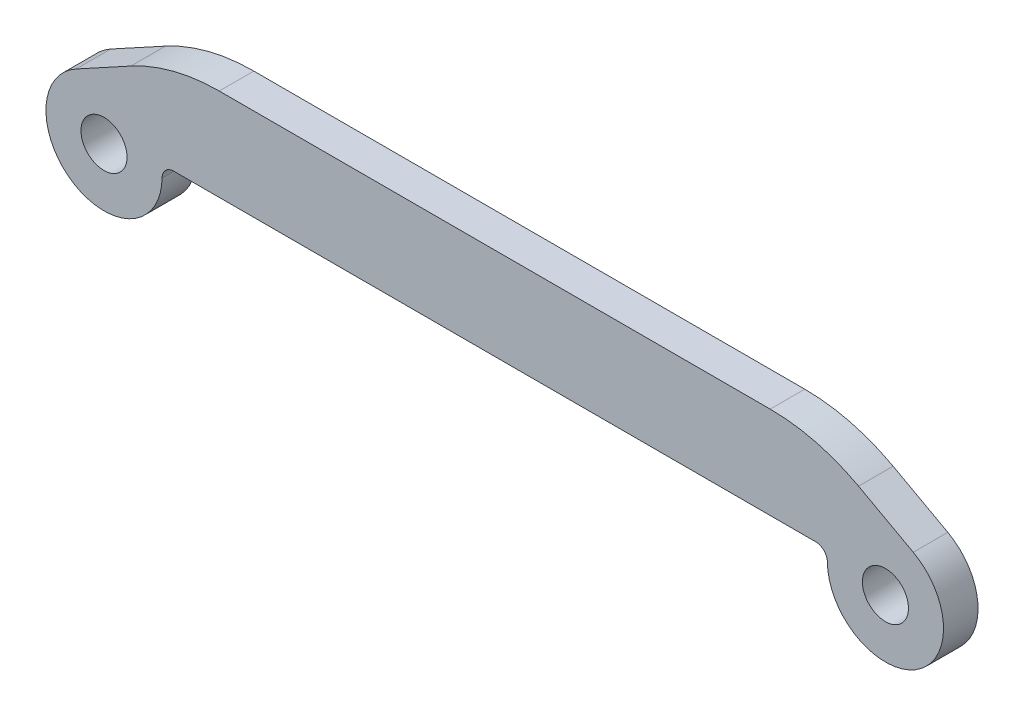
ISO-10303-21;
HEADER;
FILE_DESCRIPTION(('STEP AP214'),'2;1');
FILE_NAME('part.step','',(''),(''),'','','');
FILE_SCHEMA(('AUTOMOTIVE_DESIGN { 1 0 10303 214 1 1 1 1 }'));
ENDSEC;
DATA;
#1=APPLICATION_CONTEXT('core data for automotive mechanical design processes');
#2=APPLICATION_PROTOCOL_DEFINITION('international standard','automotive_design',2000,#1);
#3=PRODUCT_CONTEXT('',#1,'mechanical');
#4=PRODUCT('Part','Part','',(#3));
#5=PRODUCT_RELATED_PRODUCT_CATEGORY('part','',(#4));
#6=PRODUCT_DEFINITION_FORMATION('','',#4);
#7=PRODUCT_DEFINITION_CONTEXT('part definition',#1,'design');
#8=PRODUCT_DEFINITION('design','',#6,#7);
#9=PRODUCT_DEFINITION_SHAPE('','',#8);
#10=(LENGTH_UNIT() NAMED_UNIT(*) SI_UNIT(.MILLI.,.METRE.));
#11=(NAMED_UNIT(*) PLANE_ANGLE_UNIT() SI_UNIT($,.RADIAN.));
#12=(NAMED_UNIT(*) SI_UNIT($,.STERADIAN.) SOLID_ANGLE_UNIT());
#13=UNCERTAINTY_MEASURE_WITH_UNIT(LENGTH_MEASURE(1.E-05),#10,'distance_accuracy_value','');
#14=(GEOMETRIC_REPRESENTATION_CONTEXT(3) GLOBAL_UNCERTAINTY_ASSIGNED_CONTEXT((#13)) GLOBAL_UNIT_ASSIGNED_CONTEXT((#10,
#11,#12)) REPRESENTATION_CONTEXT('',''));
#15=CARTESIAN_POINT('',(0.,0.,0.));
#16=DIRECTION('',(0.,0.,1.));
#17=DIRECTION('',(1.,0.,0.));
#18=AXIS2_PLACEMENT_3D('',#15,#16,#17);
#19=CARTESIAN_POINT('',(-26.9239999999982,-7.1247,1.190625));
#20=DIRECTION('',(0.,0.,1.));
#21=DIRECTION('',(1.,0.,0.));
#22=AXIS2_PLACEMENT_3D('',#19,#20,#21);
#23=PLANE('',#22);
#24=CARTESIAN_POINT('',(-26.9239999999982,-7.1247,1.190625));
#25=DIRECTION('',(0.,0.,1.));
#26=DIRECTION('',(1.,0.,0.));
#27=AXIS2_PLACEMENT_3D('',#24,#25,#26);
#28=CIRCLE('',#27,1.5875);
#29=CARTESIAN_POINT('',(-28.5114999999982,-7.1247,1.190625));
#30=VERTEX_POINT('',#29);
#31=EDGE_CURVE('E248',#30,#30,#28,.T.);
#32=ORIENTED_EDGE('',*,*,#31,.F.);
#33=EDGE_LOOP('',(#32));
#34=FACE_BOUND('',#33,.T.);
#35=DIRECTION('',(-0.877633945750256,0.479331469097154,0.));
#36=VECTOR('',#35,1.);
#37=CARTESIAN_POINT('',(22.225,0.,1.190625));
#38=LINE('',#37,#36);
#39=CARTESIAN_POINT('',(28.8415655421214,-3.61372540002593,1.190625));
#40=VERTEX_POINT('',#39);
#41=CARTESIAN_POINT('',(25.0703922728796,-1.55404888897174,1.190625));
#42=VERTEX_POINT('',#41);
#43=EDGE_CURVE('E237',#40,#42,#38,.T.);
#44=ORIENTED_EDGE('',*,*,#43,.T.);
#45=CARTESIAN_POINT('',(18.9828826153457,-12.7,1.190625));
#46=DIRECTION('',(0.,0.,1.));
#47=DIRECTION('',(1.,0.,0.));
#48=AXIS2_PLACEMENT_3D('',#45,#46,#47);
#49=CIRCLE('',#48,12.7);
#50=CARTESIAN_POINT('',(18.9828826153457,0.,1.190625));
#51=VERTEX_POINT('',#50);
#52=EDGE_CURVE('E196',#42,#51,#49,.T.);
#53=ORIENTED_EDGE('',*,*,#52,.T.);
#54=DIRECTION('',(-1.,0.,0.));
#55=VECTOR('',#54,1.);
#56=CARTESIAN_POINT('',(-22.225,0.,1.190625));
#57=LINE('',#56,#55);
#58=CARTESIAN_POINT('',(-18.9828826153456,0.,1.190625));
#59=VERTEX_POINT('',#58);
#60=EDGE_CURVE('E166',#51,#59,#57,.T.);
#61=ORIENTED_EDGE('',*,*,#60,.T.);
#62=CARTESIAN_POINT('',(-18.9828826153456,-12.7,1.190625));
#63=DIRECTION('',(0.,0.,1.));
#64=DIRECTION('',(1.,0.,0.));
#65=AXIS2_PLACEMENT_3D('',#62,#63,#64);
#66=CIRCLE('',#65,12.7);
#67=CARTESIAN_POINT('',(-25.0703922728797,-1.55404888897191,1.190625));
#68=VERTEX_POINT('',#67);
#69=EDGE_CURVE('E69',#59,#68,#66,.T.);
#70=ORIENTED_EDGE('',*,*,#69,.T.);
#71=DIRECTION('',(-0.877633945750243,-0.479331469097178,0.));
#72=VECTOR('',#71,1.);
#73=CARTESIAN_POINT('',(-22.225,0.,1.190625));
#74=LINE('',#73,#72);
#75=CARTESIAN_POINT('',(-28.8415655421214,-3.61372540002615,1.190625));
#76=VERTEX_POINT('',#75);
#77=EDGE_CURVE('E131',#68,#76,#74,.T.);
#78=ORIENTED_EDGE('',*,*,#77,.T.);
#79=CARTESIAN_POINT('',(-26.9239999999982,-7.1247,1.190625));
#80=DIRECTION('',(0.,0.,1.));
#81=DIRECTION('',(1.,0.,0.));
#82=AXIS2_PLACEMENT_3D('',#79,#80,#81);
#83=CIRCLE('',#82,4.0005);
#84=CARTESIAN_POINT('',(-22.9236253300362,-7.15636622691118,1.190625));
#85=VERTEX_POINT('',#84);
#86=EDGE_CURVE('E134',#76,#85,#83,.T.);
#87=ORIENTED_EDGE('',*,*,#86,.T.);
#88=CARTESIAN_POINT('',(-22.110850793917,-7.16279999999789,1.190625));
#89=DIRECTION('',(0.,0.,1.));
#90=DIRECTION('',(1.,0.,0.));
#91=AXIS2_PLACEMENT_3D('',#88,#89,#90);
#92=CIRCLE('',#91,0.8128);
#93=CARTESIAN_POINT('',(-22.1108507939169,-6.34999999999995,1.190625));
#94=VERTEX_POINT('',#93);
#95=EDGE_CURVE('E205',#85,#94,#92,.F.);
#96=ORIENTED_EDGE('',*,*,#95,.T.);
#97=DIRECTION('',(1.,0.,0.));
#98=VECTOR('',#97,1.);
#99=CARTESIAN_POINT('',(-22.9992273747369,-6.35,1.190625));
#100=LINE('',#99,#98);
#101=CARTESIAN_POINT('',(22.1108507939171,-6.34999999999768,1.190625));
#102=VERTEX_POINT('',#101);
#103=EDGE_CURVE('E151',#94,#102,#100,.T.);
#104=ORIENTED_EDGE('',*,*,#103,.T.);
#105=CARTESIAN_POINT('',(22.110850793917,-7.16279999999974,1.190625));
#106=DIRECTION('',(0.,0.,1.));
#107=DIRECTION('',(1.,0.,0.));
#108=AXIS2_PLACEMENT_3D('',#105,#106,#107);
#109=CIRCLE('',#108,0.8128);
#110=CARTESIAN_POINT('',(22.9236253300363,-7.15636622691268,1.190625));
#111=VERTEX_POINT('',#110);
#112=EDGE_CURVE('E12',#102,#111,#109,.F.);
#113=ORIENTED_EDGE('',*,*,#112,.T.);
#114=CARTESIAN_POINT('',(26.9239999999982,-7.12469999999978,1.190625));
#115=DIRECTION('',(0.,0.,1.));
#116=DIRECTION('',(-1.,0.,0.));
#117=AXIS2_PLACEMENT_3D('',#114,#115,#116);
#118=CIRCLE('',#117,4.0005);
#119=EDGE_CURVE('E232',#111,#40,#118,.T.);
#120=ORIENTED_EDGE('',*,*,#119,.T.);
#121=EDGE_LOOP('',(#44,#53,#61,#70,#78,#87,#96,#104,#113,#120));
#122=FACE_BOUND('',#121,.T.);
#123=CARTESIAN_POINT('',(26.9239999999982,-7.12469999999978,1.190625));
#124=DIRECTION('',(0.,0.,1.));
#125=DIRECTION('',(-1.,0.,0.));
#126=AXIS2_PLACEMENT_3D('',#123,#124,#125);
#127=CIRCLE('',#126,1.5875);
#128=CARTESIAN_POINT('',(25.3364999999982,-7.12469999999978,1.190625));
#129=VERTEX_POINT('',#128);
#130=EDGE_CURVE('E419',#129,#129,#127,.T.);
#131=ORIENTED_EDGE('',*,*,#130,.F.);
#132=EDGE_LOOP('',(#131));
#133=FACE_BOUND('',#132,.T.);
#134=ADVANCED_FACE('F53',(#34,#122,#133),#23,.T.);
#135=CARTESIAN_POINT('',(-26.9239999999982,-7.1247,-1.190625));
#136=DIRECTION('',(0.,0.,1.));
#137=DIRECTION('',(1.,0.,0.));
#138=AXIS2_PLACEMENT_3D('',#135,#136,#137);
#139=PLANE('',#138);
#140=DIRECTION('',(-1.,0.,0.));
#141=VECTOR('',#140,1.);
#142=CARTESIAN_POINT('',(-22.225,0.,-1.190625));
#143=LINE('',#142,#141);
#144=CARTESIAN_POINT('',(18.9828826153457,0.,-1.190625));
#145=VERTEX_POINT('',#144);
#146=CARTESIAN_POINT('',(-18.9828826153456,0.,-1.190625));
#147=VERTEX_POINT('',#146);
#148=EDGE_CURVE('E141',#145,#147,#143,.T.);
#149=ORIENTED_EDGE('',*,*,#148,.F.);
#150=CARTESIAN_POINT('',(18.9828826153457,-12.7,-1.190625));
#151=DIRECTION('',(0.,0.,1.));
#152=DIRECTION('',(1.,0.,0.));
#153=AXIS2_PLACEMENT_3D('',#150,#151,#152);
#154=CIRCLE('',#153,12.7);
#155=CARTESIAN_POINT('',(25.0703922728796,-1.55404888897174,-1.190625));
#156=VERTEX_POINT('',#155);
#157=EDGE_CURVE('E189',#145,#156,#154,.F.);
#158=ORIENTED_EDGE('',*,*,#157,.T.);
#159=DIRECTION('',(-0.877633945750256,0.479331469097154,0.));
#160=VECTOR('',#159,1.);
#161=CARTESIAN_POINT('',(22.225,0.,-1.190625));
#162=LINE('',#161,#160);
#163=CARTESIAN_POINT('',(28.8415655421214,-3.61372540002593,-1.190625));
#164=VERTEX_POINT('',#163);
#165=EDGE_CURVE('E253',#164,#156,#162,.T.);
#166=ORIENTED_EDGE('',*,*,#165,.F.);
#167=CARTESIAN_POINT('',(26.9239999999982,-7.12469999999978,-1.190625));
#168=DIRECTION('',(0.,0.,1.));
#169=DIRECTION('',(-1.,0.,0.));
#170=AXIS2_PLACEMENT_3D('',#167,#168,#169);
#171=CIRCLE('',#170,4.0005);
#172=CARTESIAN_POINT('',(22.9236253300363,-7.15636622691268,-1.190625));
#173=VERTEX_POINT('',#172);
#174=EDGE_CURVE('E217',#173,#164,#171,.T.);
#175=ORIENTED_EDGE('',*,*,#174,.F.);
#176=CARTESIAN_POINT('',(22.110850793917,-7.16279999999974,-1.190625));
#177=DIRECTION('',(0.,0.,1.));
#178=DIRECTION('',(1.,0.,0.));
#179=AXIS2_PLACEMENT_3D('',#176,#177,#178);
#180=CIRCLE('',#179,0.8128);
#181=CARTESIAN_POINT('',(22.1108507939171,-6.34999999999974,-1.190625));
#182=VERTEX_POINT('',#181);
#183=EDGE_CURVE('E62',#173,#182,#180,.T.);
#184=ORIENTED_EDGE('',*,*,#183,.T.);
#185=DIRECTION('',(1.,0.,0.));
#186=VECTOR('',#185,1.);
#187=CARTESIAN_POINT('',(22.999227374737,-6.34999999999978,-1.190625));
#188=LINE('',#187,#186);
#189=CARTESIAN_POINT('',(-22.1108507939169,-6.34999999999789,-1.190625));
#190=VERTEX_POINT('',#189);
#191=EDGE_CURVE('E215',#190,#182,#188,.T.);
#192=ORIENTED_EDGE('',*,*,#191,.F.);
#193=CARTESIAN_POINT('',(-22.110850793917,-7.16279999999789,-1.190625));
#194=DIRECTION('',(0.,0.,1.));
#195=DIRECTION('',(1.,0.,0.));
#196=AXIS2_PLACEMENT_3D('',#193,#194,#195);
#197=CIRCLE('',#196,0.8128);
#198=CARTESIAN_POINT('',(-22.9236253300362,-7.15636622691118,-1.190625));
#199=VERTEX_POINT('',#198);
#200=EDGE_CURVE('E202',#190,#199,#197,.T.);
#201=ORIENTED_EDGE('',*,*,#200,.T.);
#202=CARTESIAN_POINT('',(-26.9239999999982,-7.1247,-1.190625));
#203=DIRECTION('',(0.,0.,1.));
#204=DIRECTION('',(1.,0.,0.));
#205=AXIS2_PLACEMENT_3D('',#202,#203,#204);
#206=CIRCLE('',#205,4.0005);
#207=CARTESIAN_POINT('',(-28.8415655421214,-3.61372540002615,-1.190625));
#208=VERTEX_POINT('',#207);
#209=EDGE_CURVE('E227',#208,#199,#206,.T.);
#210=ORIENTED_EDGE('',*,*,#209,.F.);
#211=DIRECTION('',(-0.877633945750243,-0.479331469097178,0.));
#212=VECTOR('',#211,1.);
#213=CARTESIAN_POINT('',(-22.225,0.,-1.190625));
#214=LINE('',#213,#212);
#215=CARTESIAN_POINT('',(-25.0703922728797,-1.55404888897191,-1.190625));
#216=VERTEX_POINT('',#215);
#217=EDGE_CURVE('E155',#216,#208,#214,.T.);
#218=ORIENTED_EDGE('',*,*,#217,.F.);
#219=CARTESIAN_POINT('',(-18.9828826153456,-12.7,-1.190625));
#220=DIRECTION('',(0.,0.,1.));
#221=DIRECTION('',(1.,0.,0.));
#222=AXIS2_PLACEMENT_3D('',#219,#220,#221);
#223=CIRCLE('',#222,12.7);
#224=EDGE_CURVE('E186',#216,#147,#223,.F.);
#225=ORIENTED_EDGE('',*,*,#224,.T.);
#226=EDGE_LOOP('',(#149,#158,#166,#175,#184,#192,#201,#210,#218,#225));
#227=FACE_BOUND('',#226,.T.);
#228=CARTESIAN_POINT('',(-26.9239999999982,-7.1247,-1.190625));
#229=DIRECTION('',(0.,0.,1.));
#230=DIRECTION('',(1.,0.,0.));
#231=AXIS2_PLACEMENT_3D('',#228,#229,#230);
#232=CIRCLE('',#231,1.5875);
#233=CARTESIAN_POINT('',(-28.5114999999982,-7.1247,-1.190625));
#234=VERTEX_POINT('',#233);
#235=EDGE_CURVE('E417',#234,#234,#232,.T.);
#236=ORIENTED_EDGE('',*,*,#235,.T.);
#237=EDGE_LOOP('',(#236));
#238=FACE_BOUND('',#237,.T.);
#239=CARTESIAN_POINT('',(26.9239999999982,-7.12469999999978,-1.190625));
#240=DIRECTION('',(0.,0.,1.));
#241=DIRECTION('',(-1.,0.,0.));
#242=AXIS2_PLACEMENT_3D('',#239,#240,#241);
#243=CIRCLE('',#242,1.5875);
#244=CARTESIAN_POINT('',(25.3364999999982,-7.12469999999978,-1.190625));
#245=VERTEX_POINT('',#244);
#246=EDGE_CURVE('E425',#245,#245,#243,.T.);
#247=ORIENTED_EDGE('',*,*,#246,.T.);
#248=EDGE_LOOP('',(#247));
#249=FACE_BOUND('',#248,.T.);
#250=ADVANCED_FACE('F213',(#227,#238,#249),#139,.F.);
#251=CARTESIAN_POINT('',(-22.225,0.,1.190625));
#252=DIRECTION('',(0.479331469097178,-0.877633945750243,0.));
#253=DIRECTION('',(0.877633945750243,0.479331469097178,0.));
#254=AXIS2_PLACEMENT_3D('',#251,#252,#253);
#255=PLANE('',#254);
#256=ORIENTED_EDGE('',*,*,#77,.F.);
#257=DIRECTION('',(0.,0.,-1.));
#258=VECTOR('',#257,1.);
#259=CARTESIAN_POINT('',(-25.0703922728797,-1.55404888897191,1.190625));
#260=LINE('',#259,#258);
#261=EDGE_CURVE('E199',#68,#216,#260,.T.);
#262=ORIENTED_EDGE('',*,*,#261,.T.);
#263=ORIENTED_EDGE('',*,*,#217,.T.);
#264=DIRECTION('',(0.,0.,-1.));
#265=VECTOR('',#264,1.);
#266=CARTESIAN_POINT('',(-28.8415655421214,-3.61372540002615,1.190625));
#267=LINE('',#266,#265);
#268=EDGE_CURVE('E147',#76,#208,#267,.T.);
#269=ORIENTED_EDGE('',*,*,#268,.F.);
#270=EDGE_LOOP('',(#256,#262,#263,#269));
#271=FACE_BOUND('',#270,.T.);
#272=ADVANCED_FACE('F153',(#271),#255,.F.);
#273=CARTESIAN_POINT('',(-26.9239999999982,-7.1247,1.190625));
#274=DIRECTION('',(0.,0.,-1.));
#275=DIRECTION('',(-1.,0.,0.));
#276=AXIS2_PLACEMENT_3D('',#273,#274,#275);
#277=CYLINDRICAL_SURFACE('',#276,4.0005);
#278=ORIENTED_EDGE('',*,*,#209,.T.);
#279=DIRECTION('',(0.,0.,-1.));
#280=VECTOR('',#279,1.);
#281=CARTESIAN_POINT('',(-22.9236253300362,-7.15636622691118,1.190625));
#282=LINE('',#281,#280);
#283=EDGE_CURVE('E149',#199,#85,#282,.F.);
#284=ORIENTED_EDGE('',*,*,#283,.T.);
#285=ORIENTED_EDGE('',*,*,#86,.F.);
#286=ORIENTED_EDGE('',*,*,#268,.T.);
#287=EDGE_LOOP('',(#278,#284,#285,#286));
#288=FACE_BOUND('',#287,.T.);
#289=ADVANCED_FACE('F146',(#288),#277,.T.);
#290=CARTESIAN_POINT('',(22.999227374737,-6.34999999999978,1.190625));
#291=DIRECTION('',(0.,1.,0.));
#292=DIRECTION('',(-1.,0.,0.));
#293=AXIS2_PLACEMENT_3D('',#290,#291,#292);
#294=PLANE('',#293);
#295=ORIENTED_EDGE('',*,*,#103,.F.);
#296=DIRECTION('',(0.,0.,1.));
#297=VECTOR('',#296,1.);
#298=CARTESIAN_POINT('',(-22.1108507939169,-6.34999999999789,-1.190625));
#299=LINE('',#298,#297);
#300=EDGE_CURVE('E163',#94,#190,#299,.F.);
#301=ORIENTED_EDGE('',*,*,#300,.T.);
#302=ORIENTED_EDGE('',*,*,#191,.T.);
#303=DIRECTION('',(0.,0.,1.));
#304=VECTOR('',#303,1.);
#305=CARTESIAN_POINT('',(22.1108507939171,-6.34999999999974,1.190625));
#306=LINE('',#305,#304);
#307=EDGE_CURVE('E158',#182,#102,#306,.T.);
#308=ORIENTED_EDGE('',*,*,#307,.T.);
#309=EDGE_LOOP('',(#295,#301,#302,#308));
#310=FACE_BOUND('',#309,.T.);
#311=ADVANCED_FACE('F223',(#310),#294,.F.);
#312=CARTESIAN_POINT('',(26.9239999999982,-7.12469999999978,1.190625));
#313=DIRECTION('',(0.,0.,-1.));
#314=DIRECTION('',(-1.,0.,0.));
#315=AXIS2_PLACEMENT_3D('',#312,#313,#314);
#316=CYLINDRICAL_SURFACE('',#315,4.0005);
#317=ORIENTED_EDGE('',*,*,#119,.F.);
#318=DIRECTION('',(0.,0.,-1.));
#319=VECTOR('',#318,1.);
#320=CARTESIAN_POINT('',(22.9236253300363,-7.15636622691268,1.190625));
#321=LINE('',#320,#319);
#322=EDGE_CURVE('E175',#111,#173,#321,.T.);
#323=ORIENTED_EDGE('',*,*,#322,.T.);
#324=ORIENTED_EDGE('',*,*,#174,.T.);
#325=DIRECTION('',(0.,0.,-1.));
#326=VECTOR('',#325,1.);
#327=CARTESIAN_POINT('',(28.8415655421214,-3.61372540002593,1.190625));
#328=LINE('',#327,#326);
#329=EDGE_CURVE('E159',#40,#164,#328,.T.);
#330=ORIENTED_EDGE('',*,*,#329,.F.);
#331=EDGE_LOOP('',(#317,#323,#324,#330));
#332=FACE_BOUND('',#331,.T.);
#333=ADVANCED_FACE('F235',(#332),#316,.T.);
#334=CARTESIAN_POINT('',(22.225,0.,1.190625));
#335=DIRECTION('',(-0.479331469097154,-0.877633945750257,0.));
#336=DIRECTION('',(0.877633945750256,-0.479331469097154,0.));
#337=AXIS2_PLACEMENT_3D('',#334,#335,#336);
#338=PLANE('',#337);
#339=ORIENTED_EDGE('',*,*,#165,.T.);
#340=DIRECTION('',(0.,0.,-1.));
#341=VECTOR('',#340,1.);
#342=CARTESIAN_POINT('',(25.0703922728796,-1.55404888897174,1.190625));
#343=LINE('',#342,#341);
#344=EDGE_CURVE('E77',#156,#42,#343,.F.);
#345=ORIENTED_EDGE('',*,*,#344,.T.);
#346=ORIENTED_EDGE('',*,*,#43,.F.);
#347=ORIENTED_EDGE('',*,*,#329,.T.);
#348=EDGE_LOOP('',(#339,#345,#346,#347));
#349=FACE_BOUND('',#348,.T.);
#350=ADVANCED_FACE('F290',(#349),#338,.F.);
#351=CARTESIAN_POINT('',(-22.225,0.,1.190625));
#352=DIRECTION('',(0.,-1.,0.));
#353=DIRECTION('',(0.,0.,-1.));
#354=AXIS2_PLACEMENT_3D('',#351,#352,#353);
#355=PLANE('',#354);
#356=ORIENTED_EDGE('',*,*,#60,.F.);
#357=DIRECTION('',(0.,0.,-1.));
#358=VECTOR('',#357,1.);
#359=CARTESIAN_POINT('',(18.9828826153457,0.,1.190625));
#360=LINE('',#359,#358);
#361=EDGE_CURVE('E182',#51,#145,#360,.T.);
#362=ORIENTED_EDGE('',*,*,#361,.T.);
#363=ORIENTED_EDGE('',*,*,#148,.T.);
#364=DIRECTION('',(0.,0.,-1.));
#365=VECTOR('',#364,1.);
#366=CARTESIAN_POINT('',(-18.9828826153456,0.,1.190625));
#367=LINE('',#366,#365);
#368=EDGE_CURVE('E179',#147,#59,#367,.F.);
#369=ORIENTED_EDGE('',*,*,#368,.T.);
#370=EDGE_LOOP('',(#356,#362,#363,#369));
#371=FACE_BOUND('',#370,.T.);
#372=ADVANCED_FACE('F260',(#371),#355,.F.);
#373=CARTESIAN_POINT('',(-26.9239999999982,-7.1247,1.190625));
#374=DIRECTION('',(0.,0.,-1.));
#375=DIRECTION('',(-1.,0.,0.));
#376=AXIS2_PLACEMENT_3D('',#373,#374,#375);
#377=CYLINDRICAL_SURFACE('',#376,1.5875);
#378=CARTESIAN_POINT('',(-28.5114999999982,-7.1247,1.190625));
#379=CARTESIAN_POINT('',(-28.5114999999982,-7.1247,1.1658203125));
#380=CARTESIAN_POINT('',(-28.5114999999982,-7.1247,1.141015625));
#381=CARTESIAN_POINT('',(-28.5114999999982,-7.1247,1.09140625));
#382=CARTESIAN_POINT('',(-28.5114999999982,-7.1247,1.0666015625));
#383=CARTESIAN_POINT('',(-28.5114999999982,-7.1247,1.0169921875));
#384=CARTESIAN_POINT('',(-28.5114999999982,-7.1247,0.9921875));
#385=CARTESIAN_POINT('',(-28.5114999999982,-7.1247,0.942578125));
#386=CARTESIAN_POINT('',(-28.5114999999982,-7.1247,0.9177734375));
#387=CARTESIAN_POINT('',(-28.5114999999982,-7.1247,0.8681640625));
#388=CARTESIAN_POINT('',(-28.5114999999982,-7.1247,0.843359375));
#389=CARTESIAN_POINT('',(-28.5114999999982,-7.1247,0.79375));
#390=CARTESIAN_POINT('',(-28.5114999999982,-7.1247,0.7689453125));
#391=CARTESIAN_POINT('',(-28.5114999999982,-7.1247,0.7193359375));
#392=CARTESIAN_POINT('',(-28.5114999999982,-7.1247,0.69453125));
#393=CARTESIAN_POINT('',(-28.5114999999982,-7.1247,0.644921875));
#394=CARTESIAN_POINT('',(-28.5114999999982,-7.1247,0.6201171875));
#395=CARTESIAN_POINT('',(-28.5114999999982,-7.1247,0.5705078125));
#396=CARTESIAN_POINT('',(-28.5114999999982,-7.1247,0.545703125));
#397=CARTESIAN_POINT('',(-28.5114999999982,-7.1247,0.49609375));
#398=CARTESIAN_POINT('',(-28.5114999999982,-7.1247,0.4712890625));
#399=CARTESIAN_POINT('',(-28.5114999999982,-7.1247,0.4216796875));
#400=CARTESIAN_POINT('',(-28.5114999999982,-7.1247,0.396875));
#401=CARTESIAN_POINT('',(-28.5114999999982,-7.1247,0.347265625));
#402=CARTESIAN_POINT('',(-28.5114999999982,-7.1247,0.3224609375));
#403=CARTESIAN_POINT('',(-28.5114999999982,-7.1247,0.2728515625));
#404=CARTESIAN_POINT('',(-28.5114999999982,-7.1247,0.248046875));
#405=CARTESIAN_POINT('',(-28.5114999999982,-7.1247,0.1984375));
#406=CARTESIAN_POINT('',(-28.5114999999982,-7.1247,0.1736328125));
#407=CARTESIAN_POINT('',(-28.5114999999982,-7.1247,0.1240234375));
#408=CARTESIAN_POINT('',(-28.5114999999982,-7.1247,0.0992187499999998));
#409=CARTESIAN_POINT('',(-28.5114999999982,-7.1247,0.0496093749999998));
#410=CARTESIAN_POINT('',(-28.5114999999982,-7.1247,0.0248046874999998));
#411=CARTESIAN_POINT('',(-28.5114999999982,-7.1247,-0.0248046875000002));
#412=CARTESIAN_POINT('',(-28.5114999999982,-7.1247,-0.0496093750000002));
#413=CARTESIAN_POINT('',(-28.5114999999982,-7.1247,-0.0992187500000003));
#414=CARTESIAN_POINT('',(-28.5114999999982,-7.1247,-0.1240234375));
#415=CARTESIAN_POINT('',(-28.5114999999982,-7.1247,-0.1736328125));
#416=CARTESIAN_POINT('',(-28.5114999999982,-7.1247,-0.1984375));
#417=CARTESIAN_POINT('',(-28.5114999999982,-7.1247,-0.248046875));
#418=CARTESIAN_POINT('',(-28.5114999999982,-7.1247,-0.2728515625));
#419=CARTESIAN_POINT('',(-28.5114999999982,-7.1247,-0.3224609375));
#420=CARTESIAN_POINT('',(-28.5114999999982,-7.1247,-0.347265625));
#421=CARTESIAN_POINT('',(-28.5114999999982,-7.1247,-0.396875));
#422=CARTESIAN_POINT('',(-28.5114999999982,-7.1247,-0.4216796875));
#423=CARTESIAN_POINT('',(-28.5114999999982,-7.1247,-0.4712890625));
#424=CARTESIAN_POINT('',(-28.5114999999982,-7.1247,-0.49609375));
#425=CARTESIAN_POINT('',(-28.5114999999982,-7.1247,-0.545703125));
#426=CARTESIAN_POINT('',(-28.5114999999982,-7.1247,-0.5705078125));
#427=CARTESIAN_POINT('',(-28.5114999999982,-7.1247,-0.6201171875));
#428=CARTESIAN_POINT('',(-28.5114999999982,-7.1247,-0.644921875));
#429=CARTESIAN_POINT('',(-28.5114999999982,-7.1247,-0.69453125));
#430=CARTESIAN_POINT('',(-28.5114999999982,-7.1247,-0.7193359375));
#431=CARTESIAN_POINT('',(-28.5114999999982,-7.1247,-0.7689453125));
#432=CARTESIAN_POINT('',(-28.5114999999982,-7.1247,-0.79375));
#433=CARTESIAN_POINT('',(-28.5114999999982,-7.1247,-0.843359375));
#434=CARTESIAN_POINT('',(-28.5114999999982,-7.1247,-0.8681640625));
#435=CARTESIAN_POINT('',(-28.5114999999982,-7.1247,-0.9177734375));
#436=CARTESIAN_POINT('',(-28.5114999999982,-7.1247,-0.942578125));
#437=CARTESIAN_POINT('',(-28.5114999999982,-7.1247,-0.9921875));
#438=CARTESIAN_POINT('',(-28.5114999999982,-7.1247,-1.0169921875));
#439=CARTESIAN_POINT('',(-28.5114999999982,-7.1247,-1.0666015625));
#440=CARTESIAN_POINT('',(-28.5114999999982,-7.1247,-1.09140625));
#441=CARTESIAN_POINT('',(-28.5114999999982,-7.1247,-1.141015625));
#442=CARTESIAN_POINT('',(-28.5114999999982,-7.1247,-1.1658203125));
#443=CARTESIAN_POINT('',(-28.5114999999982,-7.1247,-1.190625));
#444=B_SPLINE_CURVE_WITH_KNOTS('',3,(#378,#379,#380,#381,#382,#383,#384,#385,#386,#387,#388,
#389,#390,#391,#392,#393,#394,#395,#396,#397,#398,#399,#400,#401,#402,#403,#404,#405,#406,#407,
#408,#409,#410,#411,#412,#413,#414,#415,#416,#417,#418,#419,#420,#421,#422,#423,#424,#425,#426,
#427,#428,#429,#430,#431,#432,#433,#434,#435,#436,#437,#438,#439,#440,#441,#442,#443),
.UNSPECIFIED.,.F.,.F.,(4,2,2,2,2,2,2,2,2,2,2,2,2,2,2,2,2,2,2,2,2,2,2,2,2,2,2,2,2,2,2,2,4),(0.,
0.0744140624999998,0.148828125,0.2232421875,0.29765625,0.3720703125,0.446484375,0.5208984375,
0.5953125,0.6697265625,0.744140625,0.8185546875,0.89296875,0.9673828125,1.041796875,
1.1162109375,1.190625,1.2650390625,1.339453125,1.4138671875,1.48828125,1.5626953125,1.637109375,
1.7115234375,1.7859375,1.8603515625,1.934765625,2.0091796875,2.08359375,2.1580078125,
2.232421875,2.3068359375,2.38125),.UNSPECIFIED.);
#445=EDGE_CURVE('BSEAM275',#30,#234,#444,.T.);
#446=ORIENTED_EDGE('',*,*,#31,.T.);
#447=ORIENTED_EDGE('',*,*,#235,.F.);
#448=ORIENTED_EDGE('',*,*,#445,.T.);
#449=ORIENTED_EDGE('',*,*,#445,.F.);
#450=EDGE_LOOP('',(#446,#448,#447,#449));
#451=FACE_BOUND('',#450,.T.);
#452=ADVANCED_FACE('F275',(#451),#377,.F.);
#453=CARTESIAN_POINT('',(26.9239999999982,-7.12469999999978,1.190625));
#454=DIRECTION('',(0.,0.,-1.));
#455=DIRECTION('',(-1.,0.,0.));
#456=AXIS2_PLACEMENT_3D('',#453,#454,#455);
#457=CYLINDRICAL_SURFACE('',#456,1.5875);
#458=CARTESIAN_POINT('',(25.3364999999982,-7.12469999999978,1.190625));
#459=CARTESIAN_POINT('',(25.3364999999982,-7.12469999999978,1.1658203125));
#460=CARTESIAN_POINT('',(25.3364999999982,-7.12469999999978,1.141015625));
#461=CARTESIAN_POINT('',(25.3364999999982,-7.12469999999978,1.09140625));
#462=CARTESIAN_POINT('',(25.3364999999982,-7.12469999999978,1.0666015625));
#463=CARTESIAN_POINT('',(25.3364999999982,-7.12469999999978,1.0169921875));
#464=CARTESIAN_POINT('',(25.3364999999982,-7.12469999999978,0.9921875));
#465=CARTESIAN_POINT('',(25.3364999999982,-7.12469999999978,0.942578125));
#466=CARTESIAN_POINT('',(25.3364999999982,-7.12469999999978,0.9177734375));
#467=CARTESIAN_POINT('',(25.3364999999982,-7.12469999999978,0.8681640625));
#468=CARTESIAN_POINT('',(25.3364999999982,-7.12469999999978,0.843359375));
#469=CARTESIAN_POINT('',(25.3364999999982,-7.12469999999978,0.79375));
#470=CARTESIAN_POINT('',(25.3364999999982,-7.12469999999978,0.7689453125));
#471=CARTESIAN_POINT('',(25.3364999999982,-7.12469999999978,0.7193359375));
#472=CARTESIAN_POINT('',(25.3364999999982,-7.12469999999978,0.69453125));
#473=CARTESIAN_POINT('',(25.3364999999982,-7.12469999999978,0.644921875));
#474=CARTESIAN_POINT('',(25.3364999999982,-7.12469999999978,0.6201171875));
#475=CARTESIAN_POINT('',(25.3364999999982,-7.12469999999978,0.5705078125));
#476=CARTESIAN_POINT('',(25.3364999999982,-7.12469999999978,0.545703125));
#477=CARTESIAN_POINT('',(25.3364999999982,-7.12469999999978,0.49609375));
#478=CARTESIAN_POINT('',(25.3364999999982,-7.12469999999978,0.4712890625));
#479=CARTESIAN_POINT('',(25.3364999999982,-7.12469999999978,0.4216796875));
#480=CARTESIAN_POINT('',(25.3364999999982,-7.12469999999978,0.396875));
#481=CARTESIAN_POINT('',(25.3364999999982,-7.12469999999978,0.347265625));
#482=CARTESIAN_POINT('',(25.3364999999982,-7.12469999999978,0.3224609375));
#483=CARTESIAN_POINT('',(25.3364999999982,-7.12469999999978,0.2728515625));
#484=CARTESIAN_POINT('',(25.3364999999982,-7.12469999999978,0.248046875));
#485=CARTESIAN_POINT('',(25.3364999999982,-7.12469999999978,0.1984375));
#486=CARTESIAN_POINT('',(25.3364999999982,-7.12469999999978,0.1736328125));
#487=CARTESIAN_POINT('',(25.3364999999982,-7.12469999999978,0.1240234375));
#488=CARTESIAN_POINT('',(25.3364999999982,-7.12469999999978,0.0992187499999998));
#489=CARTESIAN_POINT('',(25.3364999999982,-7.12469999999978,0.0496093749999998));
#490=CARTESIAN_POINT('',(25.3364999999982,-7.12469999999978,0.0248046874999998));
#491=CARTESIAN_POINT('',(25.3364999999982,-7.12469999999978,-0.0248046875000002));
#492=CARTESIAN_POINT('',(25.3364999999982,-7.12469999999978,-0.0496093750000002));
#493=CARTESIAN_POINT('',(25.3364999999982,-7.12469999999978,-0.0992187500000003));
#494=CARTESIAN_POINT('',(25.3364999999982,-7.12469999999978,-0.1240234375));
#495=CARTESIAN_POINT('',(25.3364999999982,-7.12469999999978,-0.1736328125));
#496=CARTESIAN_POINT('',(25.3364999999982,-7.12469999999978,-0.1984375));
#497=CARTESIAN_POINT('',(25.3364999999982,-7.12469999999978,-0.248046875));
#498=CARTESIAN_POINT('',(25.3364999999982,-7.12469999999978,-0.2728515625));
#499=CARTESIAN_POINT('',(25.3364999999982,-7.12469999999978,-0.3224609375));
#500=CARTESIAN_POINT('',(25.3364999999982,-7.12469999999978,-0.347265625));
#501=CARTESIAN_POINT('',(25.3364999999982,-7.12469999999978,-0.396875));
#502=CARTESIAN_POINT('',(25.3364999999982,-7.12469999999978,-0.4216796875));
#503=CARTESIAN_POINT('',(25.3364999999982,-7.12469999999978,-0.4712890625));
#504=CARTESIAN_POINT('',(25.3364999999982,-7.12469999999978,-0.49609375));
#505=CARTESIAN_POINT('',(25.3364999999982,-7.12469999999978,-0.545703125));
#506=CARTESIAN_POINT('',(25.3364999999982,-7.12469999999978,-0.5705078125));
#507=CARTESIAN_POINT('',(25.3364999999982,-7.12469999999978,-0.6201171875));
#508=CARTESIAN_POINT('',(25.3364999999982,-7.12469999999978,-0.644921875));
#509=CARTESIAN_POINT('',(25.3364999999982,-7.12469999999978,-0.69453125));
#510=CARTESIAN_POINT('',(25.3364999999982,-7.12469999999978,-0.7193359375));
#511=CARTESIAN_POINT('',(25.3364999999982,-7.12469999999978,-0.7689453125));
#512=CARTESIAN_POINT('',(25.3364999999982,-7.12469999999978,-0.79375));
#513=CARTESIAN_POINT('',(25.3364999999982,-7.12469999999978,-0.843359375));
#514=CARTESIAN_POINT('',(25.3364999999982,-7.12469999999978,-0.8681640625));
#515=CARTESIAN_POINT('',(25.3364999999982,-7.12469999999978,-0.9177734375));
#516=CARTESIAN_POINT('',(25.3364999999982,-7.12469999999978,-0.942578125));
#517=CARTESIAN_POINT('',(25.3364999999982,-7.12469999999978,-0.9921875));
#518=CARTESIAN_POINT('',(25.3364999999982,-7.12469999999978,-1.0169921875));
#519=CARTESIAN_POINT('',(25.3364999999982,-7.12469999999978,-1.0666015625));
#520=CARTESIAN_POINT('',(25.3364999999982,-7.12469999999978,-1.09140625));
#521=CARTESIAN_POINT('',(25.3364999999982,-7.12469999999978,-1.141015625));
#522=CARTESIAN_POINT('',(25.3364999999982,-7.12469999999978,-1.1658203125));
#523=CARTESIAN_POINT('',(25.3364999999982,-7.12469999999978,-1.190625));
#524=B_SPLINE_CURVE_WITH_KNOTS('',3,(#458,#459,#460,#461,#462,#463,#464,#465,#466,#467,#468,
#469,#470,#471,#472,#473,#474,#475,#476,#477,#478,#479,#480,#481,#482,#483,#484,#485,#486,#487,
#488,#489,#490,#491,#492,#493,#494,#495,#496,#497,#498,#499,#500,#501,#502,#503,#504,#505,#506,
#507,#508,#509,#510,#511,#512,#513,#514,#515,#516,#517,#518,#519,#520,#521,#522,#523),
.UNSPECIFIED.,.F.,.F.,(4,2,2,2,2,2,2,2,2,2,2,2,2,2,2,2,2,2,2,2,2,2,2,2,2,2,2,2,2,2,2,2,4),(0.,
0.0744140624999998,0.148828125,0.2232421875,0.29765625,0.3720703125,0.446484375,0.5208984375,
0.5953125,0.6697265625,0.744140625,0.8185546875,0.89296875,0.9673828125,1.041796875,
1.1162109375,1.190625,1.2650390625,1.339453125,1.4138671875,1.48828125,1.5626953125,1.637109375,
1.7115234375,1.7859375,1.8603515625,1.934765625,2.0091796875,2.08359375,2.1580078125,
2.232421875,2.3068359375,2.38125),.UNSPECIFIED.);
#525=EDGE_CURVE('BSEAM266',#129,#245,#524,.T.);
#526=ORIENTED_EDGE('',*,*,#130,.T.);
#527=ORIENTED_EDGE('',*,*,#246,.F.);
#528=ORIENTED_EDGE('',*,*,#525,.T.);
#529=ORIENTED_EDGE('',*,*,#525,.F.);
#530=EDGE_LOOP('',(#526,#528,#527,#529));
#531=FACE_BOUND('',#530,.T.);
#532=ADVANCED_FACE('F266',(#531),#457,.F.);
#533=CARTESIAN_POINT('',(-22.110850793917,-7.16279999999789,1.190625));
#534=DIRECTION('',(0.,0.,-1.));
#535=DIRECTION('',(-1.,0.,0.));
#536=AXIS2_PLACEMENT_3D('',#533,#534,#535);
#537=CYLINDRICAL_SURFACE('',#536,0.8128);
#538=ORIENTED_EDGE('',*,*,#95,.F.);
#539=ORIENTED_EDGE('',*,*,#283,.F.);
#540=ORIENTED_EDGE('',*,*,#200,.F.);
#541=ORIENTED_EDGE('',*,*,#300,.F.);
#542=EDGE_LOOP('',(#538,#539,#540,#541));
#543=FACE_BOUND('',#542,.T.);
#544=ADVANCED_FACE('F264',(#543),#537,.F.);
#545=CARTESIAN_POINT('',(22.110850793917,-7.16279999999974,1.190625));
#546=DIRECTION('',(0.,0.,-1.));
#547=DIRECTION('',(-1.,0.,0.));
#548=AXIS2_PLACEMENT_3D('',#545,#546,#547);
#549=CYLINDRICAL_SURFACE('',#548,0.8128);
#550=ORIENTED_EDGE('',*,*,#112,.F.);
#551=ORIENTED_EDGE('',*,*,#307,.F.);
#552=ORIENTED_EDGE('',*,*,#183,.F.);
#553=ORIENTED_EDGE('',*,*,#322,.F.);
#554=EDGE_LOOP('',(#550,#551,#552,#553));
#555=FACE_BOUND('',#554,.T.);
#556=ADVANCED_FACE('F230',(#555),#549,.F.);
#557=CARTESIAN_POINT('',(18.9828826153457,-12.7,1.190625));
#558=DIRECTION('',(0.,0.,-1.));
#559=DIRECTION('',(-1.,0.,0.));
#560=AXIS2_PLACEMENT_3D('',#557,#558,#559);
#561=CYLINDRICAL_SURFACE('',#560,12.7);
#562=ORIENTED_EDGE('',*,*,#52,.F.);
#563=ORIENTED_EDGE('',*,*,#344,.F.);
#564=ORIENTED_EDGE('',*,*,#157,.F.);
#565=ORIENTED_EDGE('',*,*,#361,.F.);
#566=EDGE_LOOP('',(#562,#563,#564,#565));
#567=FACE_BOUND('',#566,.T.);
#568=ADVANCED_FACE('F272',(#567),#561,.T.);
#569=CARTESIAN_POINT('',(-18.9828826153456,-12.7,1.190625));
#570=DIRECTION('',(0.,0.,-1.));
#571=DIRECTION('',(-1.,0.,0.));
#572=AXIS2_PLACEMENT_3D('',#569,#570,#571);
#573=CYLINDRICAL_SURFACE('',#572,12.7);
#574=ORIENTED_EDGE('',*,*,#69,.F.);
#575=ORIENTED_EDGE('',*,*,#368,.F.);
#576=ORIENTED_EDGE('',*,*,#224,.F.);
#577=ORIENTED_EDGE('',*,*,#261,.F.);
#578=EDGE_LOOP('',(#574,#575,#576,#577));
#579=FACE_BOUND('',#578,.T.);
#580=ADVANCED_FACE('F55',(#579),#573,.T.);
#581=CLOSED_SHELL('',(#134,#250,#272,#289,#311,#333,#350,#372,#452,#532,#544,#556,#568,#580));
#582=MANIFOLD_SOLID_BREP('B2',#581);
#583=ADVANCED_BREP_SHAPE_REPRESENTATION('',(#18,#582),#14);
#584=SHAPE_DEFINITION_REPRESENTATION(#9,#583);
ENDSEC;
END-ISO-10303-21;
